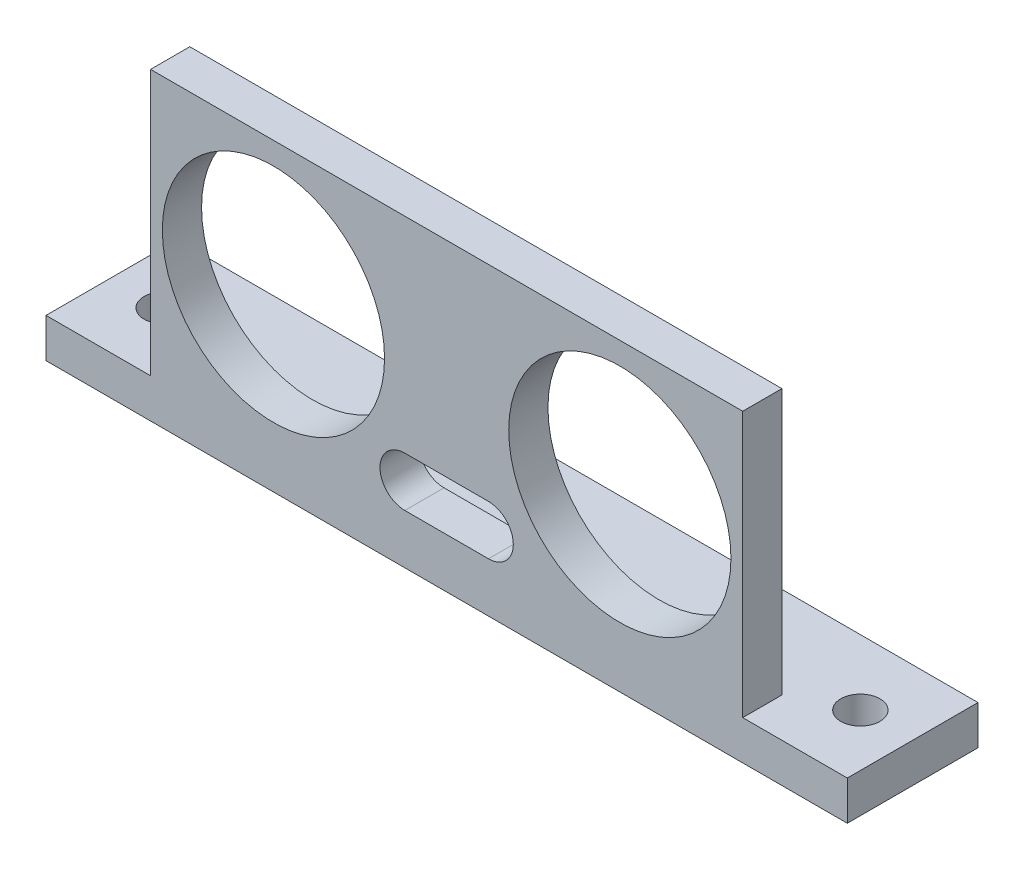
ISO-10303-21;
HEADER;
FILE_DESCRIPTION(('STEP AP214'),'2;1');
FILE_NAME('part.step','',(''),(''),'','','');
FILE_SCHEMA(('AUTOMOTIVE_DESIGN { 1 0 10303 214 1 1 1 1 }'));
ENDSEC;
DATA;
#1=APPLICATION_CONTEXT('core data for automotive mechanical design processes');
#2=APPLICATION_PROTOCOL_DEFINITION('international standard','automotive_design',2000,#1);
#3=PRODUCT_CONTEXT('',#1,'mechanical');
#4=PRODUCT('Part','Part','',(#3));
#5=PRODUCT_RELATED_PRODUCT_CATEGORY('part','',(#4));
#6=PRODUCT_DEFINITION_FORMATION('','',#4);
#7=PRODUCT_DEFINITION_CONTEXT('part definition',#1,'design');
#8=PRODUCT_DEFINITION('design','',#6,#7);
#9=PRODUCT_DEFINITION_SHAPE('','',#8);
#10=(LENGTH_UNIT() NAMED_UNIT(*) SI_UNIT(.MILLI.,.METRE.));
#11=(NAMED_UNIT(*) PLANE_ANGLE_UNIT() SI_UNIT($,.RADIAN.));
#12=(NAMED_UNIT(*) SI_UNIT($,.STERADIAN.) SOLID_ANGLE_UNIT());
#13=UNCERTAINTY_MEASURE_WITH_UNIT(LENGTH_MEASURE(1.E-05),#10,'distance_accuracy_value','');
#14=(GEOMETRIC_REPRESENTATION_CONTEXT(3) GLOBAL_UNCERTAINTY_ASSIGNED_CONTEXT((#13)) GLOBAL_UNIT_ASSIGNED_CONTEXT((#10,
#11,#12)) REPRESENTATION_CONTEXT('',''));
#15=CARTESIAN_POINT('',(0.,0.,0.));
#16=DIRECTION('',(0.,0.,1.));
#17=DIRECTION('',(1.,0.,0.));
#18=AXIS2_PLACEMENT_3D('',#15,#16,#17);
#19=CARTESIAN_POINT('',(98.6393724543672,-8.15776135163671,10.));
#20=DIRECTION('',(0.,-1.,0.));
#21=DIRECTION('',(1.,0.,0.));
#22=AXIS2_PLACEMENT_3D('',#19,#20,#21);
#23=PLANE('',#22);
#24=CARTESIAN_POINT('',(-57.3606275456328,-8.15776135163673,5.));
#25=DIRECTION('',(0.,-1.,0.));
#26=DIRECTION('',(1.,0.,0.));
#27=AXIS2_PLACEMENT_3D('',#24,#25,#26);
#28=CIRCLE('',#27,1.5);
#29=CARTESIAN_POINT('',(-55.8606275456328,-8.15776135163673,5.));
#30=VERTEX_POINT('',#29);
#31=EDGE_CURVE('E152',#30,#30,#28,.T.);
#32=ORIENTED_EDGE('',*,*,#31,.T.);
#33=EDGE_LOOP('',(#32));
#34=FACE_BOUND('',#33,.T.);
#35=CARTESIAN_POINT('',(-4.06062754563281,-8.15776135163673,5.));
#36=DIRECTION('',(0.,-1.,0.));
#37=DIRECTION('',(1.,0.,0.));
#38=AXIS2_PLACEMENT_3D('',#35,#36,#37);
#39=CIRCLE('',#38,1.5);
#40=CARTESIAN_POINT('',(-2.56062754563281,-8.15776135163673,5.));
#41=VERTEX_POINT('',#40);
#42=EDGE_CURVE('E238',#41,#41,#39,.T.);
#43=ORIENTED_EDGE('',*,*,#42,.T.);
#44=EDGE_LOOP('',(#43));
#45=FACE_BOUND('',#44,.T.);
#46=DIRECTION('',(-1.,0.,0.));
#47=VECTOR('',#46,1.);
#48=CARTESIAN_POINT('',(98.6393724543672,-8.15776135163671,0.));
#49=LINE('',#48,#47);
#50=CARTESIAN_POINT('',(-0.0606275456328146,-8.15776135163673,0.));
#51=VERTEX_POINT('',#50);
#52=CARTESIAN_POINT('',(-61.3606275456328,-8.15776135163673,0.));
#53=VERTEX_POINT('',#52);
#54=EDGE_CURVE('E141',#51,#53,#49,.T.);
#55=ORIENTED_EDGE('',*,*,#54,.T.);
#56=DIRECTION('',(0.,0.,-1.));
#57=VECTOR('',#56,1.);
#58=CARTESIAN_POINT('',(-61.3606275456328,-8.15776135163673,0.));
#59=LINE('',#58,#57);
#60=CARTESIAN_POINT('',(-61.3606275456328,-8.15776135163673,10.));
#61=VERTEX_POINT('',#60);
#62=EDGE_CURVE('E159',#61,#53,#59,.T.);
#63=ORIENTED_EDGE('',*,*,#62,.F.);
#64=DIRECTION('',(-1.,0.,0.));
#65=VECTOR('',#64,1.);
#66=CARTESIAN_POINT('',(-53.3606275456328,-8.15776135163673,10.));
#67=LINE('',#66,#65);
#68=CARTESIAN_POINT('',(-53.3606275456328,-8.15776135163673,10.));
#69=VERTEX_POINT('',#68);
#70=EDGE_CURVE('E56',#69,#61,#67,.T.);
#71=ORIENTED_EDGE('',*,*,#70,.F.);
#72=DIRECTION('',(0.,0.,1.));
#73=VECTOR('',#72,1.);
#74=CARTESIAN_POINT('',(-53.3606275456328,-8.15776135163673,0.));
#75=LINE('',#74,#73);
#76=CARTESIAN_POINT('',(-53.3606275456328,-8.15776135163673,7.));
#77=VERTEX_POINT('',#76);
#78=EDGE_CURVE('E11',#77,#69,#75,.T.);
#79=ORIENTED_EDGE('',*,*,#78,.F.);
#80=DIRECTION('',(-1.,0.,0.));
#81=VECTOR('',#80,1.);
#82=CARTESIAN_POINT('',(-53.3606275456328,-8.15776135163673,7.));
#83=LINE('',#82,#81);
#84=CARTESIAN_POINT('',(-8.06062754563281,-8.15776135163673,7.));
#85=VERTEX_POINT('',#84);
#86=EDGE_CURVE('E212',#85,#77,#83,.T.);
#87=ORIENTED_EDGE('',*,*,#86,.F.);
#88=DIRECTION('',(0.,0.,-1.));
#89=VECTOR('',#88,1.);
#90=CARTESIAN_POINT('',(-8.06062754563281,-8.15776135163673,0.));
#91=LINE('',#90,#89);
#92=CARTESIAN_POINT('',(-8.06062754563281,-8.15776135163673,10.));
#93=VERTEX_POINT('',#92);
#94=EDGE_CURVE('E157',#93,#85,#91,.T.);
#95=ORIENTED_EDGE('',*,*,#94,.F.);
#96=DIRECTION('',(-1.,0.,0.));
#97=VECTOR('',#96,1.);
#98=CARTESIAN_POINT('',(-0.0606275456328146,-8.15776135163673,10.));
#99=LINE('',#98,#97);
#100=CARTESIAN_POINT('',(-0.0606275456328146,-8.15776135163673,10.));
#101=VERTEX_POINT('',#100);
#102=EDGE_CURVE('E164',#101,#93,#99,.T.);
#103=ORIENTED_EDGE('',*,*,#102,.F.);
#104=DIRECTION('',(0.,0.,1.));
#105=VECTOR('',#104,1.);
#106=CARTESIAN_POINT('',(-0.0606275456328146,-8.15776135163673,0.));
#107=LINE('',#106,#105);
#108=EDGE_CURVE('E149',#51,#101,#107,.T.);
#109=ORIENTED_EDGE('',*,*,#108,.F.);
#110=EDGE_LOOP('',(#55,#63,#71,#79,#87,#95,#103,#109));
#111=FACE_BOUND('',#110,.T.);
#112=ADVANCED_FACE('F39',(#34,#45,#111),#23,.F.);
#113=CARTESIAN_POINT('',(98.6393724543672,-11.1577613516367,10.));
#114=DIRECTION('',(0.,1.,0.));
#115=DIRECTION('',(-1.,0.,0.));
#116=AXIS2_PLACEMENT_3D('',#113,#114,#115);
#117=PLANE('',#116);
#118=CARTESIAN_POINT('',(-57.3606275456328,-11.1577613516367,5.));
#119=DIRECTION('',(0.,1.,0.));
#120=DIRECTION('',(-1.,0.,0.));
#121=AXIS2_PLACEMENT_3D('',#118,#119,#120);
#122=CIRCLE('',#121,1.5);
#123=CARTESIAN_POINT('',(-58.8606275456328,-11.1577613516367,5.));
#124=VERTEX_POINT('',#123);
#125=EDGE_CURVE('E43',#124,#124,#122,.T.);
#126=ORIENTED_EDGE('',*,*,#125,.T.);
#127=EDGE_LOOP('',(#126));
#128=FACE_BOUND('',#127,.T.);
#129=CARTESIAN_POINT('',(-4.06062754563281,-11.1577613516367,5.));
#130=DIRECTION('',(0.,1.,0.));
#131=DIRECTION('',(-1.,0.,0.));
#132=AXIS2_PLACEMENT_3D('',#129,#130,#131);
#133=CIRCLE('',#132,1.5);
#134=CARTESIAN_POINT('',(-5.56062754563281,-11.1577613516367,5.));
#135=VERTEX_POINT('',#134);
#136=EDGE_CURVE('E236',#135,#135,#133,.T.);
#137=ORIENTED_EDGE('',*,*,#136,.T.);
#138=EDGE_LOOP('',(#137));
#139=FACE_BOUND('',#138,.T.);
#140=DIRECTION('',(1.,0.,0.));
#141=VECTOR('',#140,1.);
#142=CARTESIAN_POINT('',(98.6393724543672,-11.1577613516367,10.));
#143=LINE('',#142,#141);
#144=CARTESIAN_POINT('',(-61.3606275456328,-11.1577613516367,10.));
#145=VERTEX_POINT('',#144);
#146=CARTESIAN_POINT('',(-0.0606275456328142,-11.1577613516367,10.));
#147=VERTEX_POINT('',#146);
#148=EDGE_CURVE('E48',#145,#147,#143,.T.);
#149=ORIENTED_EDGE('',*,*,#148,.F.);
#150=DIRECTION('',(0.,0.,-1.));
#151=VECTOR('',#150,1.);
#152=CARTESIAN_POINT('',(-61.3606275456328,-11.1577613516367,0.));
#153=LINE('',#152,#151);
#154=CARTESIAN_POINT('',(-61.3606275456328,-11.1577613516367,0.));
#155=VERTEX_POINT('',#154);
#156=EDGE_CURVE('E156',#145,#155,#153,.T.);
#157=ORIENTED_EDGE('',*,*,#156,.T.);
#158=DIRECTION('',(1.,0.,0.));
#159=VECTOR('',#158,1.);
#160=CARTESIAN_POINT('',(98.6393724543672,-11.1577613516367,0.));
#161=LINE('',#160,#159);
#162=CARTESIAN_POINT('',(-0.0606275456328142,-11.1577613516367,0.));
#163=VERTEX_POINT('',#162);
#164=EDGE_CURVE('E154',#155,#163,#161,.T.);
#165=ORIENTED_EDGE('',*,*,#164,.T.);
#166=DIRECTION('',(0.,0.,1.));
#167=VECTOR('',#166,1.);
#168=CARTESIAN_POINT('',(-0.0606275456328142,-11.1577613516367,0.));
#169=LINE('',#168,#167);
#170=EDGE_CURVE('E147',#163,#147,#169,.T.);
#171=ORIENTED_EDGE('',*,*,#170,.T.);
#172=EDGE_LOOP('',(#149,#157,#165,#171));
#173=FACE_BOUND('',#172,.T.);
#174=ADVANCED_FACE('F41',(#128,#139,#173),#117,.F.);
#175=CARTESIAN_POINT('',(0.,0.,10.));
#176=DIRECTION('',(0.,0.,1.));
#177=DIRECTION('',(1.,0.,0.));
#178=AXIS2_PLACEMENT_3D('',#175,#176,#177);
#179=PLANE('',#178);
#180=DIRECTION('',(0.,-1.,0.));
#181=VECTOR('',#180,1.);
#182=CARTESIAN_POINT('',(-53.3606275456328,12.1422386483633,10.));
#183=LINE('',#182,#181);
#184=CARTESIAN_POINT('',(-53.3606275456328,12.1422386483633,10.));
#185=VERTEX_POINT('',#184);
#186=EDGE_CURVE('E227',#185,#69,#183,.T.);
#187=ORIENTED_EDGE('',*,*,#186,.T.);
#188=ORIENTED_EDGE('',*,*,#70,.T.);
#189=DIRECTION('',(0.,-1.,0.));
#190=VECTOR('',#189,1.);
#191=CARTESIAN_POINT('',(-61.3606275456328,-8.15776135163673,10.));
#192=LINE('',#191,#190);
#193=EDGE_CURVE('E136',#61,#145,#192,.T.);
#194=ORIENTED_EDGE('',*,*,#193,.T.);
#195=ORIENTED_EDGE('',*,*,#148,.T.);
#196=DIRECTION('',(0.,-1.,0.));
#197=VECTOR('',#196,1.);
#198=CARTESIAN_POINT('',(-0.0606275456328146,-8.15776135163673,10.));
#199=LINE('',#198,#197);
#200=EDGE_CURVE('E134',#101,#147,#199,.T.);
#201=ORIENTED_EDGE('',*,*,#200,.F.);
#202=ORIENTED_EDGE('',*,*,#102,.T.);
#203=DIRECTION('',(0.,-1.,0.));
#204=VECTOR('',#203,1.);
#205=CARTESIAN_POINT('',(-8.06062754563283,12.1422386483633,10.));
#206=LINE('',#205,#204);
#207=CARTESIAN_POINT('',(-8.06062754563283,12.1422386483633,10.));
#208=VERTEX_POINT('',#207);
#209=EDGE_CURVE('E222',#208,#93,#206,.T.);
#210=ORIENTED_EDGE('',*,*,#209,.F.);
#211=DIRECTION('',(1.,0.,0.));
#212=VECTOR('',#211,1.);
#213=CARTESIAN_POINT('',(-53.3606275456328,12.1422386483633,10.));
#214=LINE('',#213,#212);
#215=EDGE_CURVE('E220',#185,#208,#214,.T.);
#216=ORIENTED_EDGE('',*,*,#215,.F.);
#217=EDGE_LOOP('',(#187,#188,#194,#195,#201,#202,#210,#216));
#218=FACE_BOUND('',#217,.T.);
#219=CARTESIAN_POINT('',(-43.9606275456328,1.94223864836327,10.));
#220=DIRECTION('',(0.,0.,1.));
#221=DIRECTION('',(1.,0.,0.));
#222=AXIS2_PLACEMENT_3D('',#219,#220,#221);
#223=CIRCLE('',#222,8.5);
#224=CARTESIAN_POINT('',(-35.4606275456328,1.94223864836327,10.));
#225=VERTEX_POINT('',#224);
#226=EDGE_CURVE('E209',#225,#225,#223,.T.);
#227=ORIENTED_EDGE('',*,*,#226,.F.);
#228=EDGE_LOOP('',(#227));
#229=FACE_BOUND('',#228,.T.);
#230=CARTESIAN_POINT('',(-27.5106275456328,-5.45776135163673,10.));
#231=DIRECTION('',(0.,0.,1.));
#232=DIRECTION('',(1.,0.,0.));
#233=AXIS2_PLACEMENT_3D('',#230,#231,#232);
#234=CIRCLE('',#233,1.9);
#235=CARTESIAN_POINT('',(-27.5106275456328,-7.35776135163673,10.));
#236=VERTEX_POINT('',#235);
#237=CARTESIAN_POINT('',(-27.5106275456328,-3.55776135163673,10.));
#238=VERTEX_POINT('',#237);
#239=EDGE_CURVE('E207',#236,#238,#234,.T.);
#240=ORIENTED_EDGE('',*,*,#239,.F.);
#241=DIRECTION('',(1.,0.,0.));
#242=VECTOR('',#241,1.);
#243=CARTESIAN_POINT('',(0.,-7.35776135163673,10.));
#244=LINE('',#243,#242);
#245=CARTESIAN_POINT('',(-33.9106275456328,-7.35776135163673,10.));
#246=VERTEX_POINT('',#245);
#247=EDGE_CURVE('E201',#246,#236,#244,.T.);
#248=ORIENTED_EDGE('',*,*,#247,.F.);
#249=CARTESIAN_POINT('',(-33.9106275456328,-5.45776135163673,10.));
#250=DIRECTION('',(0.,0.,1.));
#251=DIRECTION('',(1.,0.,0.));
#252=AXIS2_PLACEMENT_3D('',#249,#250,#251);
#253=CIRCLE('',#252,1.9);
#254=CARTESIAN_POINT('',(-33.9106275456328,-3.55776135163673,10.));
#255=VERTEX_POINT('',#254);
#256=EDGE_CURVE('E203',#255,#246,#253,.T.);
#257=ORIENTED_EDGE('',*,*,#256,.F.);
#258=DIRECTION('',(-1.,0.,0.));
#259=VECTOR('',#258,1.);
#260=CARTESIAN_POINT('',(0.,-3.55776135163673,10.));
#261=LINE('',#260,#259);
#262=EDGE_CURVE('E205',#238,#255,#261,.T.);
#263=ORIENTED_EDGE('',*,*,#262,.F.);
#264=EDGE_LOOP('',(#240,#248,#257,#263));
#265=FACE_BOUND('',#264,.T.);
#266=CARTESIAN_POINT('',(-17.4606275456328,1.94223864836327,10.));
#267=DIRECTION('',(0.,0.,1.));
#268=DIRECTION('',(1.,0.,0.));
#269=AXIS2_PLACEMENT_3D('',#266,#267,#268);
#270=CIRCLE('',#269,8.5);
#271=CARTESIAN_POINT('',(-8.96062754563282,1.94223864836327,10.));
#272=VERTEX_POINT('',#271);
#273=EDGE_CURVE('E198',#272,#272,#270,.T.);
#274=ORIENTED_EDGE('',*,*,#273,.F.);
#275=EDGE_LOOP('',(#274));
#276=FACE_BOUND('',#275,.T.);
#277=ADVANCED_FACE('F131',(#218,#229,#265,#276),#179,.T.);
#278=CARTESIAN_POINT('',(0.,0.,0.));
#279=DIRECTION('',(0.,0.,1.));
#280=DIRECTION('',(1.,0.,0.));
#281=AXIS2_PLACEMENT_3D('',#278,#279,#280);
#282=PLANE('',#281);
#283=ORIENTED_EDGE('',*,*,#164,.F.);
#284=DIRECTION('',(0.,-1.,0.));
#285=VECTOR('',#284,1.);
#286=CARTESIAN_POINT('',(-61.3606275456328,-8.15776135163673,0.));
#287=LINE('',#286,#285);
#288=EDGE_CURVE('E169',#53,#155,#287,.T.);
#289=ORIENTED_EDGE('',*,*,#288,.F.);
#290=ORIENTED_EDGE('',*,*,#54,.F.);
#291=DIRECTION('',(0.,-1.,0.));
#292=VECTOR('',#291,1.);
#293=CARTESIAN_POINT('',(-0.0606275456328146,-8.15776135163673,0.));
#294=LINE('',#293,#292);
#295=EDGE_CURVE('E151',#51,#163,#294,.T.);
#296=ORIENTED_EDGE('',*,*,#295,.T.);
#297=EDGE_LOOP('',(#283,#289,#290,#296));
#298=FACE_BOUND('',#297,.T.);
#299=ADVANCED_FACE('F249',(#298),#282,.F.);
#300=CARTESIAN_POINT('',(-8.06062754563283,12.1422386483633,7.));
#301=DIRECTION('',(-1.,0.,0.));
#302=DIRECTION('',(0.,-1.,0.));
#303=AXIS2_PLACEMENT_3D('',#300,#301,#302);
#304=PLANE('',#303);
#305=ORIENTED_EDGE('',*,*,#209,.T.);
#306=ORIENTED_EDGE('',*,*,#94,.T.);
#307=DIRECTION('',(0.,-1.,0.));
#308=VECTOR('',#307,1.);
#309=CARTESIAN_POINT('',(-8.06062754563283,12.1422386483633,7.));
#310=LINE('',#309,#308);
#311=CARTESIAN_POINT('',(-8.06062754563283,12.1422386483633,7.));
#312=VERTEX_POINT('',#311);
#313=EDGE_CURVE('E232',#312,#85,#310,.T.);
#314=ORIENTED_EDGE('',*,*,#313,.F.);
#315=DIRECTION('',(0.,0.,-1.));
#316=VECTOR('',#315,1.);
#317=CARTESIAN_POINT('',(-8.06062754563283,12.1422386483633,7.));
#318=LINE('',#317,#316);
#319=EDGE_CURVE('E213',#208,#312,#318,.T.);
#320=ORIENTED_EDGE('',*,*,#319,.F.);
#321=EDGE_LOOP('',(#305,#306,#314,#320));
#322=FACE_BOUND('',#321,.T.);
#323=ADVANCED_FACE('F256',(#322),#304,.F.);
#324=CARTESIAN_POINT('',(-53.3606275456328,12.1422386483633,7.));
#325=DIRECTION('',(0.,0.,1.));
#326=DIRECTION('',(1.,0.,0.));
#327=AXIS2_PLACEMENT_3D('',#324,#325,#326);
#328=PLANE('',#327);
#329=CARTESIAN_POINT('',(-43.9606275456328,1.94223864836327,7.));
#330=DIRECTION('',(0.,0.,-1.));
#331=DIRECTION('',(-1.,0.,0.));
#332=AXIS2_PLACEMENT_3D('',#329,#330,#331);
#333=CIRCLE('',#332,8.5);
#334=CARTESIAN_POINT('',(-52.4606275456328,1.94223864836327,7.));
#335=VERTEX_POINT('',#334);
#336=EDGE_CURVE('E192',#335,#335,#333,.T.);
#337=ORIENTED_EDGE('',*,*,#336,.F.);
#338=EDGE_LOOP('',(#337));
#339=FACE_BOUND('',#338,.T.);
#340=DIRECTION('',(-1.,0.,0.));
#341=VECTOR('',#340,1.);
#342=CARTESIAN_POINT('',(-27.5106275456328,-7.35776135163673,7.));
#343=LINE('',#342,#341);
#344=CARTESIAN_POINT('',(-27.5106275456328,-7.35776135163673,7.));
#345=VERTEX_POINT('',#344);
#346=CARTESIAN_POINT('',(-33.9106275456328,-7.35776135163673,7.));
#347=VERTEX_POINT('',#346);
#348=EDGE_CURVE('E188',#345,#347,#343,.T.);
#349=ORIENTED_EDGE('',*,*,#348,.F.);
#350=CARTESIAN_POINT('',(-27.5106275456328,-5.45776135163673,7.));
#351=DIRECTION('',(0.,0.,-1.));
#352=DIRECTION('',(-1.,0.,0.));
#353=AXIS2_PLACEMENT_3D('',#350,#351,#352);
#354=CIRCLE('',#353,1.9);
#355=CARTESIAN_POINT('',(-27.5106275456328,-3.55776135163673,7.));
#356=VERTEX_POINT('',#355);
#357=EDGE_CURVE('E190',#356,#345,#354,.T.);
#358=ORIENTED_EDGE('',*,*,#357,.F.);
#359=DIRECTION('',(1.,0.,0.));
#360=VECTOR('',#359,1.);
#361=CARTESIAN_POINT('',(-27.5106275456328,-3.55776135163673,7.));
#362=LINE('',#361,#360);
#363=CARTESIAN_POINT('',(-33.9106275456328,-3.55776135163673,7.));
#364=VERTEX_POINT('',#363);
#365=EDGE_CURVE('E178',#364,#356,#362,.T.);
#366=ORIENTED_EDGE('',*,*,#365,.F.);
#367=CARTESIAN_POINT('',(-33.9106275456328,-5.45776135163673,7.));
#368=DIRECTION('',(0.,0.,-1.));
#369=DIRECTION('',(-1.,0.,0.));
#370=AXIS2_PLACEMENT_3D('',#367,#368,#369);
#371=CIRCLE('',#370,1.9);
#372=EDGE_CURVE('E185',#347,#364,#371,.T.);
#373=ORIENTED_EDGE('',*,*,#372,.F.);
#374=EDGE_LOOP('',(#349,#358,#366,#373));
#375=FACE_BOUND('',#374,.T.);
#376=CARTESIAN_POINT('',(-17.4606275456328,1.94223864836327,7.));
#377=DIRECTION('',(0.,0.,-1.));
#378=DIRECTION('',(-1.,0.,0.));
#379=AXIS2_PLACEMENT_3D('',#376,#377,#378);
#380=CIRCLE('',#379,8.5);
#381=CARTESIAN_POINT('',(-25.9606275456328,1.94223864836327,7.));
#382=VERTEX_POINT('',#381);
#383=EDGE_CURVE('E195',#382,#382,#380,.T.);
#384=ORIENTED_EDGE('',*,*,#383,.F.);
#385=EDGE_LOOP('',(#384));
#386=FACE_BOUND('',#385,.T.);
#387=ORIENTED_EDGE('',*,*,#86,.T.);
#388=DIRECTION('',(0.,-1.,0.));
#389=VECTOR('',#388,1.);
#390=CARTESIAN_POINT('',(-53.3606275456328,12.1422386483633,7.));
#391=LINE('',#390,#389);
#392=CARTESIAN_POINT('',(-53.3606275456328,12.1422386483633,7.));
#393=VERTEX_POINT('',#392);
#394=EDGE_CURVE('E229',#393,#77,#391,.T.);
#395=ORIENTED_EDGE('',*,*,#394,.F.);
#396=DIRECTION('',(-1.,0.,0.));
#397=VECTOR('',#396,1.);
#398=CARTESIAN_POINT('',(-53.3606275456328,12.1422386483633,7.));
#399=LINE('',#398,#397);
#400=EDGE_CURVE('E216',#312,#393,#399,.T.);
#401=ORIENTED_EDGE('',*,*,#400,.F.);
#402=ORIENTED_EDGE('',*,*,#313,.T.);
#403=EDGE_LOOP('',(#387,#395,#401,#402));
#404=FACE_BOUND('',#403,.T.);
#405=ADVANCED_FACE('F266',(#339,#375,#386,#404),#328,.F.);
#406=CARTESIAN_POINT('',(-53.3606275456328,12.1422386483633,7.));
#407=DIRECTION('',(1.,0.,0.));
#408=DIRECTION('',(0.,1.,0.));
#409=AXIS2_PLACEMENT_3D('',#406,#407,#408);
#410=PLANE('',#409);
#411=ORIENTED_EDGE('',*,*,#394,.T.);
#412=ORIENTED_EDGE('',*,*,#78,.T.);
#413=ORIENTED_EDGE('',*,*,#186,.F.);
#414=DIRECTION('',(0.,0.,1.));
#415=VECTOR('',#414,1.);
#416=CARTESIAN_POINT('',(-53.3606275456328,12.1422386483633,7.));
#417=LINE('',#416,#415);
#418=EDGE_CURVE('E218',#393,#185,#417,.T.);
#419=ORIENTED_EDGE('',*,*,#418,.F.);
#420=EDGE_LOOP('',(#411,#412,#413,#419));
#421=FACE_BOUND('',#420,.T.);
#422=ADVANCED_FACE('F264',(#421),#410,.F.);
#423=CARTESIAN_POINT('',(0.,12.1422386483633,0.));
#424=DIRECTION('',(0.,1.,0.));
#425=DIRECTION('',(-1.,0.,0.));
#426=AXIS2_PLACEMENT_3D('',#423,#424,#425);
#427=PLANE('',#426);
#428=ORIENTED_EDGE('',*,*,#319,.T.);
#429=ORIENTED_EDGE('',*,*,#400,.T.);
#430=ORIENTED_EDGE('',*,*,#418,.T.);
#431=ORIENTED_EDGE('',*,*,#215,.T.);
#432=EDGE_LOOP('',(#428,#429,#430,#431));
#433=FACE_BOUND('',#432,.T.);
#434=ADVANCED_FACE('F259',(#433),#427,.T.);
#435=CARTESIAN_POINT('',(-17.4606275456328,1.94223864836327,27.3));
#436=DIRECTION('',(0.,0.,-1.));
#437=DIRECTION('',(-1.,0.,0.));
#438=AXIS2_PLACEMENT_3D('',#435,#436,#437);
#439=CYLINDRICAL_SURFACE('',#438,8.5);
#440=ORIENTED_EDGE('',*,*,#273,.T.);
#441=EDGE_LOOP('',(#440));
#442=FACE_BOUND('',#441,.T.);
#443=ORIENTED_EDGE('',*,*,#383,.T.);
#444=EDGE_LOOP('',(#443));
#445=FACE_BOUND('',#444,.T.);
#446=ADVANCED_FACE('F421',(#442,#445),#439,.F.);
#447=CARTESIAN_POINT('',(-27.5106275456328,-5.45776135163673,27.3));
#448=DIRECTION('',(0.,0.,-1.));
#449=DIRECTION('',(-1.,0.,0.));
#450=AXIS2_PLACEMENT_3D('',#447,#448,#449);
#451=CYLINDRICAL_SURFACE('',#450,1.9);
#452=ORIENTED_EDGE('',*,*,#239,.T.);
#453=DIRECTION('',(0.,0.,-1.));
#454=VECTOR('',#453,1.);
#455=CARTESIAN_POINT('',(-27.5106275456328,-3.55776135163673,27.3));
#456=LINE('',#455,#454);
#457=EDGE_CURVE('E172',#238,#356,#456,.T.);
#458=ORIENTED_EDGE('',*,*,#457,.T.);
#459=ORIENTED_EDGE('',*,*,#357,.T.);
#460=DIRECTION('',(0.,0.,-1.));
#461=VECTOR('',#460,1.);
#462=CARTESIAN_POINT('',(-27.5106275456328,-7.35776135163673,27.3));
#463=LINE('',#462,#461);
#464=EDGE_CURVE('E175',#236,#345,#463,.T.);
#465=ORIENTED_EDGE('',*,*,#464,.F.);
#466=EDGE_LOOP('',(#452,#458,#459,#465));
#467=FACE_BOUND('',#466,.T.);
#468=ADVANCED_FACE('F412',(#467),#451,.F.);
#469=CARTESIAN_POINT('',(-27.5106275456328,-3.55776135163673,27.3));
#470=DIRECTION('',(0.,1.,0.));
#471=DIRECTION('',(0.,0.,1.));
#472=AXIS2_PLACEMENT_3D('',#469,#470,#471);
#473=PLANE('',#472);
#474=ORIENTED_EDGE('',*,*,#262,.T.);
#475=DIRECTION('',(0.,0.,-1.));
#476=VECTOR('',#475,1.);
#477=CARTESIAN_POINT('',(-33.9106275456328,-3.55776135163673,27.3));
#478=LINE('',#477,#476);
#479=EDGE_CURVE('E180',#255,#364,#478,.T.);
#480=ORIENTED_EDGE('',*,*,#479,.T.);
#481=ORIENTED_EDGE('',*,*,#365,.T.);
#482=ORIENTED_EDGE('',*,*,#457,.F.);
#483=EDGE_LOOP('',(#474,#480,#481,#482));
#484=FACE_BOUND('',#483,.T.);
#485=ADVANCED_FACE('F403',(#484),#473,.F.);
#486=CARTESIAN_POINT('',(-33.9106275456328,-5.45776135163673,27.3));
#487=DIRECTION('',(0.,0.,-1.));
#488=DIRECTION('',(-1.,0.,0.));
#489=AXIS2_PLACEMENT_3D('',#486,#487,#488);
#490=CYLINDRICAL_SURFACE('',#489,1.9);
#491=ORIENTED_EDGE('',*,*,#256,.T.);
#492=DIRECTION('',(0.,0.,-1.));
#493=VECTOR('',#492,1.);
#494=CARTESIAN_POINT('',(-33.9106275456328,-7.35776135163673,27.3));
#495=LINE('',#494,#493);
#496=EDGE_CURVE('E63',#246,#347,#495,.T.);
#497=ORIENTED_EDGE('',*,*,#496,.T.);
#498=ORIENTED_EDGE('',*,*,#372,.T.);
#499=ORIENTED_EDGE('',*,*,#479,.F.);
#500=EDGE_LOOP('',(#491,#497,#498,#499));
#501=FACE_BOUND('',#500,.T.);
#502=ADVANCED_FACE('F395',(#501),#490,.F.);
#503=CARTESIAN_POINT('',(-27.5106275456328,-7.35776135163673,27.3));
#504=DIRECTION('',(0.,-1.,0.));
#505=DIRECTION('',(0.,0.,-1.));
#506=AXIS2_PLACEMENT_3D('',#503,#504,#505);
#507=PLANE('',#506);
#508=ORIENTED_EDGE('',*,*,#247,.T.);
#509=ORIENTED_EDGE('',*,*,#464,.T.);
#510=ORIENTED_EDGE('',*,*,#348,.T.);
#511=ORIENTED_EDGE('',*,*,#496,.F.);
#512=EDGE_LOOP('',(#508,#509,#510,#511));
#513=FACE_BOUND('',#512,.T.);
#514=ADVANCED_FACE('F387',(#513),#507,.F.);
#515=CARTESIAN_POINT('',(-43.9606275456328,1.94223864836327,27.3));
#516=DIRECTION('',(0.,0.,-1.));
#517=DIRECTION('',(-1.,0.,0.));
#518=AXIS2_PLACEMENT_3D('',#515,#516,#517);
#519=CYLINDRICAL_SURFACE('',#518,8.5);
#520=ORIENTED_EDGE('',*,*,#226,.T.);
#521=EDGE_LOOP('',(#520));
#522=FACE_BOUND('',#521,.T.);
#523=ORIENTED_EDGE('',*,*,#336,.T.);
#524=EDGE_LOOP('',(#523));
#525=FACE_BOUND('',#524,.T.);
#526=ADVANCED_FACE('F296',(#522,#525),#519,.F.);
#527=CARTESIAN_POINT('',(-61.3606275456328,-8.15776135163673,0.));
#528=DIRECTION('',(-1.,0.,0.));
#529=DIRECTION('',(0.,-1.,0.));
#530=AXIS2_PLACEMENT_3D('',#527,#528,#529);
#531=PLANE('',#530);
#532=ORIENTED_EDGE('',*,*,#156,.F.);
#533=ORIENTED_EDGE('',*,*,#193,.F.);
#534=ORIENTED_EDGE('',*,*,#62,.T.);
#535=ORIENTED_EDGE('',*,*,#288,.T.);
#536=EDGE_LOOP('',(#532,#533,#534,#535));
#537=FACE_BOUND('',#536,.T.);
#538=ADVANCED_FACE('F374',(#537),#531,.T.);
#539=CARTESIAN_POINT('',(-0.0606275456328146,-8.15776135163673,0.));
#540=DIRECTION('',(1.,0.,0.));
#541=DIRECTION('',(0.,1.,0.));
#542=AXIS2_PLACEMENT_3D('',#539,#540,#541);
#543=PLANE('',#542);
#544=ORIENTED_EDGE('',*,*,#170,.F.);
#545=ORIENTED_EDGE('',*,*,#295,.F.);
#546=ORIENTED_EDGE('',*,*,#108,.T.);
#547=ORIENTED_EDGE('',*,*,#200,.T.);
#548=EDGE_LOOP('',(#544,#545,#546,#547));
#549=FACE_BOUND('',#548,.T.);
#550=ADVANCED_FACE('F145',(#549),#543,.T.);
#551=CARTESIAN_POINT('',(-4.06062754563282,12.1422386483633,5.));
#552=DIRECTION('',(0.,-1.,0.));
#553=DIRECTION('',(1.,0.,0.));
#554=AXIS2_PLACEMENT_3D('',#551,#552,#553);
#555=CYLINDRICAL_SURFACE('',#554,1.5);
#556=ORIENTED_EDGE('',*,*,#136,.F.);
#557=EDGE_LOOP('',(#556));
#558=FACE_BOUND('',#557,.T.);
#559=ORIENTED_EDGE('',*,*,#42,.F.);
#560=EDGE_LOOP('',(#559));
#561=FACE_BOUND('',#560,.T.);
#562=ADVANCED_FACE('F351',(#558,#561),#555,.F.);
#563=CARTESIAN_POINT('',(-57.3606275456328,12.1422386483633,5.));
#564=DIRECTION('',(0.,-1.,0.));
#565=DIRECTION('',(1.,0.,0.));
#566=AXIS2_PLACEMENT_3D('',#563,#564,#565);
#567=CYLINDRICAL_SURFACE('',#566,1.5);
#568=ORIENTED_EDGE('',*,*,#125,.F.);
#569=EDGE_LOOP('',(#568));
#570=FACE_BOUND('',#569,.T.);
#571=ORIENTED_EDGE('',*,*,#31,.F.);
#572=EDGE_LOOP('',(#571));
#573=FACE_BOUND('',#572,.T.);
#574=ADVANCED_FACE('F355',(#570,#573),#567,.F.);
#575=CLOSED_SHELL('',(#112,#174,#277,#299,#323,#405,#422,#434,#446,#468,#485,#502,#514,#526,
#538,#550,#562,#574));
#576=MANIFOLD_SOLID_BREP('B2',#575);
#577=ADVANCED_BREP_SHAPE_REPRESENTATION('',(#18,#576),#14);
#578=SHAPE_DEFINITION_REPRESENTATION(#9,#577);
ENDSEC;
END-ISO-10303-21;
